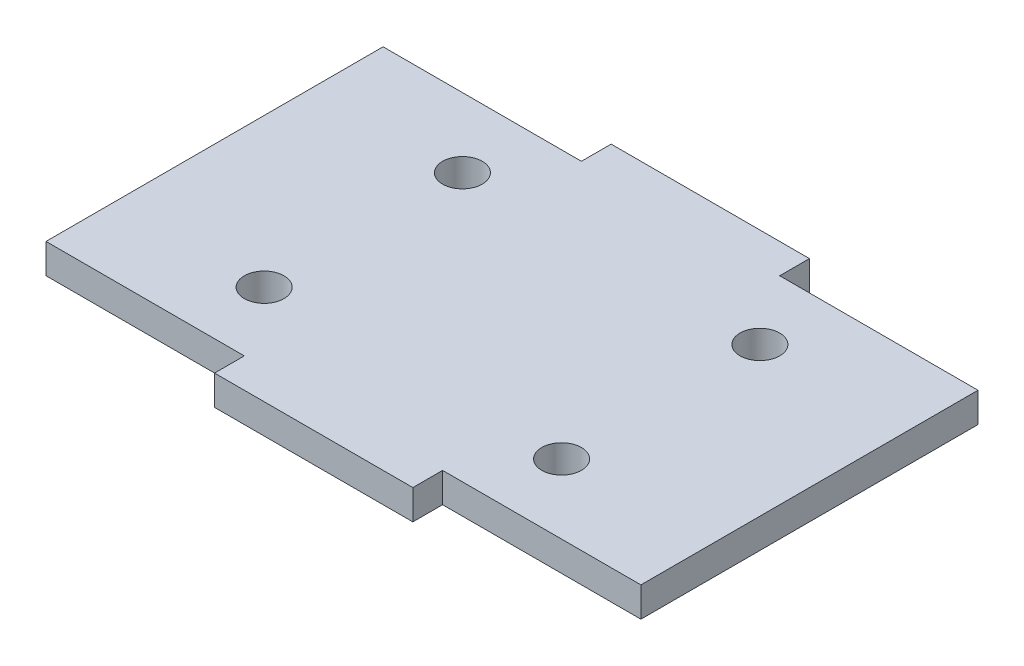
ISO-10303-21;
HEADER;
FILE_DESCRIPTION(('STEP AP214'),'2;1');
FILE_NAME('part.step','',(''),(''),'','','');
FILE_SCHEMA(('AUTOMOTIVE_DESIGN { 1 0 10303 214 1 1 1 1 }'));
ENDSEC;
DATA;
#1=APPLICATION_CONTEXT('core data for automotive mechanical design processes');
#2=APPLICATION_PROTOCOL_DEFINITION('international standard','automotive_design',2000,#1);
#3=PRODUCT_CONTEXT('',#1,'mechanical');
#4=PRODUCT('Part','Part','',(#3));
#5=PRODUCT_RELATED_PRODUCT_CATEGORY('part','',(#4));
#6=PRODUCT_DEFINITION_FORMATION('','',#4);
#7=PRODUCT_DEFINITION_CONTEXT('part definition',#1,'design');
#8=PRODUCT_DEFINITION('design','',#6,#7);
#9=PRODUCT_DEFINITION_SHAPE('','',#8);
#10=(LENGTH_UNIT() NAMED_UNIT(*) SI_UNIT(.MILLI.,.METRE.));
#11=(NAMED_UNIT(*) PLANE_ANGLE_UNIT() SI_UNIT($,.RADIAN.));
#12=(NAMED_UNIT(*) SI_UNIT($,.STERADIAN.) SOLID_ANGLE_UNIT());
#13=UNCERTAINTY_MEASURE_WITH_UNIT(LENGTH_MEASURE(1.E-05),#10,'distance_accuracy_value','');
#14=(GEOMETRIC_REPRESENTATION_CONTEXT(3) GLOBAL_UNCERTAINTY_ASSIGNED_CONTEXT((#13)) GLOBAL_UNIT_ASSIGNED_CONTEXT((#10,
#11,#12)) REPRESENTATION_CONTEXT('',''));
#15=CARTESIAN_POINT('',(0.,0.,0.));
#16=DIRECTION('',(0.,0.,1.));
#17=DIRECTION('',(1.,0.,0.));
#18=AXIS2_PLACEMENT_3D('',#15,#16,#17);
#19=CARTESIAN_POINT('',(-30.,3.,20.));
#20=DIRECTION('',(1.,0.,0.));
#21=DIRECTION('',(0.,0.,-1.));
#22=AXIS2_PLACEMENT_3D('',#19,#20,#21);
#23=PLANE('',#22);
#24=DIRECTION('',(0.,0.,1.));
#25=VECTOR('',#24,1.);
#26=CARTESIAN_POINT('',(-30.,3.,20.));
#27=LINE('',#26,#25);
#28=CARTESIAN_POINT('',(-30.,3.,-17.));
#29=VERTEX_POINT('',#28);
#30=CARTESIAN_POINT('',(-30.,3.,17.));
#31=VERTEX_POINT('',#30);
#32=EDGE_CURVE('E138',#29,#31,#27,.T.);
#33=ORIENTED_EDGE('',*,*,#32,.F.);
#34=DIRECTION('',(0.,1.,0.));
#35=VECTOR('',#34,1.);
#36=CARTESIAN_POINT('',(-30.,0.,-17.));
#37=LINE('',#36,#35);
#38=CARTESIAN_POINT('',(-30.,0.,-17.));
#39=VERTEX_POINT('',#38);
#40=EDGE_CURVE('E126',#39,#29,#37,.T.);
#41=ORIENTED_EDGE('',*,*,#40,.F.);
#42=DIRECTION('',(0.,0.,1.));
#43=VECTOR('',#42,1.);
#44=CARTESIAN_POINT('',(-30.,0.,20.));
#45=LINE('',#44,#43);
#46=CARTESIAN_POINT('',(-30.,0.,17.));
#47=VERTEX_POINT('',#46);
#48=EDGE_CURVE('E136',#39,#47,#45,.T.);
#49=ORIENTED_EDGE('',*,*,#48,.T.);
#50=DIRECTION('',(0.,1.,0.));
#51=VECTOR('',#50,1.);
#52=CARTESIAN_POINT('',(-30.,0.,17.));
#53=LINE('',#52,#51);
#54=EDGE_CURVE('E151',#47,#31,#53,.T.);
#55=ORIENTED_EDGE('',*,*,#54,.T.);
#56=EDGE_LOOP('',(#33,#41,#49,#55));
#57=FACE_BOUND('',#56,.T.);
#58=ADVANCED_FACE('F34',(#57),#23,.F.);
#59=CARTESIAN_POINT('',(30.,3.,20.));
#60=DIRECTION('',(0.,0.,-1.));
#61=DIRECTION('',(-1.,0.,0.));
#62=AXIS2_PLACEMENT_3D('',#59,#60,#61);
#63=PLANE('',#62);
#64=DIRECTION('',(1.,0.,0.));
#65=VECTOR('',#64,1.);
#66=CARTESIAN_POINT('',(30.,0.,20.));
#67=LINE('',#66,#65);
#68=CARTESIAN_POINT('',(-10.,0.,20.));
#69=VERTEX_POINT('',#68);
#70=CARTESIAN_POINT('',(9.99999999999999,0.,20.));
#71=VERTEX_POINT('',#70);
#72=EDGE_CURVE('E144',#69,#71,#67,.T.);
#73=ORIENTED_EDGE('',*,*,#72,.T.);
#74=DIRECTION('',(0.,1.,0.));
#75=VECTOR('',#74,1.);
#76=CARTESIAN_POINT('',(9.99999999999999,3.,20.));
#77=LINE('',#76,#75);
#78=CARTESIAN_POINT('',(9.99999999999999,3.,20.));
#79=VERTEX_POINT('',#78);
#80=EDGE_CURVE('E186',#71,#79,#77,.T.);
#81=ORIENTED_EDGE('',*,*,#80,.T.);
#82=DIRECTION('',(1.,0.,0.));
#83=VECTOR('',#82,1.);
#84=CARTESIAN_POINT('',(30.,3.,20.));
#85=LINE('',#84,#83);
#86=CARTESIAN_POINT('',(-10.,3.,20.));
#87=VERTEX_POINT('',#86);
#88=EDGE_CURVE('E169',#87,#79,#85,.T.);
#89=ORIENTED_EDGE('',*,*,#88,.F.);
#90=DIRECTION('',(0.,-1.,0.));
#91=VECTOR('',#90,1.);
#92=CARTESIAN_POINT('',(-10.,3.,20.));
#93=LINE('',#92,#91);
#94=EDGE_CURVE('E145',#87,#69,#93,.T.);
#95=ORIENTED_EDGE('',*,*,#94,.T.);
#96=EDGE_LOOP('',(#73,#81,#89,#95));
#97=FACE_BOUND('',#96,.T.);
#98=ADVANCED_FACE('F288',(#97),#63,.F.);
#99=CARTESIAN_POINT('',(30.,3.,20.));
#100=DIRECTION('',(-1.,0.,0.));
#101=DIRECTION('',(0.,0.,1.));
#102=AXIS2_PLACEMENT_3D('',#99,#100,#101);
#103=PLANE('',#102);
#104=DIRECTION('',(0.,0.,-1.));
#105=VECTOR('',#104,1.);
#106=CARTESIAN_POINT('',(30.,0.,20.));
#107=LINE('',#106,#105);
#108=CARTESIAN_POINT('',(30.,0.,17.));
#109=VERTEX_POINT('',#108);
#110=CARTESIAN_POINT('',(30.,0.,-17.));
#111=VERTEX_POINT('',#110);
#112=EDGE_CURVE('E148',#109,#111,#107,.T.);
#113=ORIENTED_EDGE('',*,*,#112,.T.);
#114=DIRECTION('',(0.,1.,0.));
#115=VECTOR('',#114,1.);
#116=CARTESIAN_POINT('',(30.,0.,-17.));
#117=LINE('',#116,#115);
#118=CARTESIAN_POINT('',(30.,3.,-17.));
#119=VERTEX_POINT('',#118);
#120=EDGE_CURVE('E208',#111,#119,#117,.T.);
#121=ORIENTED_EDGE('',*,*,#120,.T.);
#122=DIRECTION('',(0.,0.,-1.));
#123=VECTOR('',#122,1.);
#124=CARTESIAN_POINT('',(30.,3.,20.));
#125=LINE('',#124,#123);
#126=CARTESIAN_POINT('',(30.,3.,17.));
#127=VERTEX_POINT('',#126);
#128=EDGE_CURVE('E163',#127,#119,#125,.T.);
#129=ORIENTED_EDGE('',*,*,#128,.F.);
#130=DIRECTION('',(0.,1.,0.));
#131=VECTOR('',#130,1.);
#132=CARTESIAN_POINT('',(30.,0.,17.));
#133=LINE('',#132,#131);
#134=EDGE_CURVE('E191',#109,#127,#133,.T.);
#135=ORIENTED_EDGE('',*,*,#134,.F.);
#136=EDGE_LOOP('',(#113,#121,#129,#135));
#137=FACE_BOUND('',#136,.T.);
#138=ADVANCED_FACE('F278',(#137),#103,.F.);
#139=CARTESIAN_POINT('',(30.,3.,-20.));
#140=DIRECTION('',(0.,0.,1.));
#141=DIRECTION('',(1.,0.,0.));
#142=AXIS2_PLACEMENT_3D('',#139,#140,#141);
#143=PLANE('',#142);
#144=DIRECTION('',(-1.,0.,0.));
#145=VECTOR('',#144,1.);
#146=CARTESIAN_POINT('',(30.,0.,-20.));
#147=LINE('',#146,#145);
#148=CARTESIAN_POINT('',(9.99999999999999,0.,-20.));
#149=VERTEX_POINT('',#148);
#150=CARTESIAN_POINT('',(-10.,0.,-20.));
#151=VERTEX_POINT('',#150);
#152=EDGE_CURVE('E159',#149,#151,#147,.T.);
#153=ORIENTED_EDGE('',*,*,#152,.T.);
#154=DIRECTION('',(0.,1.,0.));
#155=VECTOR('',#154,1.);
#156=CARTESIAN_POINT('',(-10.,3.,-20.));
#157=LINE('',#156,#155);
#158=CARTESIAN_POINT('',(-10.,3.,-20.));
#159=VERTEX_POINT('',#158);
#160=EDGE_CURVE('E217',#151,#159,#157,.T.);
#161=ORIENTED_EDGE('',*,*,#160,.T.);
#162=DIRECTION('',(-1.,0.,0.));
#163=VECTOR('',#162,1.);
#164=CARTESIAN_POINT('',(30.,3.,-20.));
#165=LINE('',#164,#163);
#166=CARTESIAN_POINT('',(9.99999999999999,3.,-20.));
#167=VERTEX_POINT('',#166);
#168=EDGE_CURVE('E154',#167,#159,#165,.T.);
#169=ORIENTED_EDGE('',*,*,#168,.F.);
#170=DIRECTION('',(0.,-1.,0.));
#171=VECTOR('',#170,1.);
#172=CARTESIAN_POINT('',(9.99999999999999,3.,-20.));
#173=LINE('',#172,#171);
#174=EDGE_CURVE('E201',#167,#149,#173,.T.);
#175=ORIENTED_EDGE('',*,*,#174,.T.);
#176=EDGE_LOOP('',(#153,#161,#169,#175));
#177=FACE_BOUND('',#176,.T.);
#178=ADVANCED_FACE('F263',(#177),#143,.F.);
#179=CARTESIAN_POINT('',(0.,3.,0.));
#180=DIRECTION('',(0.,1.,0.));
#181=DIRECTION('',(0.,0.,1.));
#182=AXIS2_PLACEMENT_3D('',#179,#180,#181);
#183=PLANE('',#182);
#184=CARTESIAN_POINT('',(15.,3.,-10.));
#185=DIRECTION('',(0.,1.,0.));
#186=DIRECTION('',(0.,0.,-1.));
#187=AXIS2_PLACEMENT_3D('',#184,#185,#186);
#188=CIRCLE('',#187,2.);
#189=CARTESIAN_POINT('',(15.,3.,-12.));
#190=VERTEX_POINT('',#189);
#191=EDGE_CURVE('E245',#190,#190,#188,.T.);
#192=ORIENTED_EDGE('',*,*,#191,.F.);
#193=EDGE_LOOP('',(#192));
#194=FACE_BOUND('',#193,.T.);
#195=CARTESIAN_POINT('',(15.,3.,9.99999999999999));
#196=DIRECTION('',(0.,1.,0.));
#197=DIRECTION('',(0.,0.,1.));
#198=AXIS2_PLACEMENT_3D('',#195,#196,#197);
#199=CIRCLE('',#198,1.99999999999999);
#200=CARTESIAN_POINT('',(15.,3.,12.));
#201=VERTEX_POINT('',#200);
#202=EDGE_CURVE('E239',#201,#201,#199,.T.);
#203=ORIENTED_EDGE('',*,*,#202,.F.);
#204=EDGE_LOOP('',(#203));
#205=FACE_BOUND('',#204,.T.);
#206=CARTESIAN_POINT('',(-15.,3.,9.99999999999999));
#207=DIRECTION('',(0.,1.,0.));
#208=DIRECTION('',(0.,0.,-1.));
#209=AXIS2_PLACEMENT_3D('',#206,#207,#208);
#210=CIRCLE('',#209,2.);
#211=CARTESIAN_POINT('',(-15.,3.,7.99999999999999));
#212=VERTEX_POINT('',#211);
#213=EDGE_CURVE('E233',#212,#212,#210,.T.);
#214=ORIENTED_EDGE('',*,*,#213,.F.);
#215=EDGE_LOOP('',(#214));
#216=FACE_BOUND('',#215,.T.);
#217=CARTESIAN_POINT('',(-15.,3.,-10.));
#218=DIRECTION('',(0.,1.,0.));
#219=DIRECTION('',(0.,0.,1.));
#220=AXIS2_PLACEMENT_3D('',#217,#218,#219);
#221=CIRCLE('',#220,2.);
#222=CARTESIAN_POINT('',(-15.,3.,-8.));
#223=VERTEX_POINT('',#222);
#224=EDGE_CURVE('E227',#223,#223,#221,.T.);
#225=ORIENTED_EDGE('',*,*,#224,.F.);
#226=EDGE_LOOP('',(#225));
#227=FACE_BOUND('',#226,.T.);
#228=DIRECTION('',(0.,0.,-1.));
#229=VECTOR('',#228,1.);
#230=CARTESIAN_POINT('',(-10.,3.,-23.));
#231=LINE('',#230,#229);
#232=CARTESIAN_POINT('',(-10.,3.,-17.));
#233=VERTEX_POINT('',#232);
#234=EDGE_CURVE('E131',#233,#159,#231,.T.);
#235=ORIENTED_EDGE('',*,*,#234,.F.);
#236=DIRECTION('',(1.,0.,0.));
#237=VECTOR('',#236,1.);
#238=CARTESIAN_POINT('',(-10.,3.,-17.));
#239=LINE('',#238,#237);
#240=EDGE_CURVE('E223',#29,#233,#239,.T.);
#241=ORIENTED_EDGE('',*,*,#240,.F.);
#242=ORIENTED_EDGE('',*,*,#32,.T.);
#243=DIRECTION('',(-1.,0.,0.));
#244=VECTOR('',#243,1.);
#245=CARTESIAN_POINT('',(-10.,3.,17.));
#246=LINE('',#245,#244);
#247=CARTESIAN_POINT('',(-10.,3.,17.));
#248=VERTEX_POINT('',#247);
#249=EDGE_CURVE('E181',#248,#31,#246,.T.);
#250=ORIENTED_EDGE('',*,*,#249,.F.);
#251=DIRECTION('',(0.,0.,-1.));
#252=VECTOR('',#251,1.);
#253=CARTESIAN_POINT('',(-10.,3.,23.));
#254=LINE('',#253,#252);
#255=EDGE_CURVE('E184',#87,#248,#254,.T.);
#256=ORIENTED_EDGE('',*,*,#255,.F.);
#257=ORIENTED_EDGE('',*,*,#88,.T.);
#258=DIRECTION('',(0.,0.,1.));
#259=VECTOR('',#258,1.);
#260=CARTESIAN_POINT('',(9.99999999999999,3.,23.));
#261=LINE('',#260,#259);
#262=CARTESIAN_POINT('',(9.99999999999999,3.,17.));
#263=VERTEX_POINT('',#262);
#264=EDGE_CURVE('E199',#263,#79,#261,.T.);
#265=ORIENTED_EDGE('',*,*,#264,.F.);
#266=DIRECTION('',(-1.,0.,0.));
#267=VECTOR('',#266,1.);
#268=CARTESIAN_POINT('',(9.99999999999999,3.,17.));
#269=LINE('',#268,#267);
#270=EDGE_CURVE('E195',#127,#263,#269,.T.);
#271=ORIENTED_EDGE('',*,*,#270,.F.);
#272=ORIENTED_EDGE('',*,*,#128,.T.);
#273=DIRECTION('',(1.,0.,0.));
#274=VECTOR('',#273,1.);
#275=CARTESIAN_POINT('',(9.99999999999999,3.,-17.));
#276=LINE('',#275,#274);
#277=CARTESIAN_POINT('',(9.99999999999999,3.,-17.));
#278=VERTEX_POINT('',#277);
#279=EDGE_CURVE('E213',#278,#119,#276,.T.);
#280=ORIENTED_EDGE('',*,*,#279,.F.);
#281=DIRECTION('',(0.,0.,1.));
#282=VECTOR('',#281,1.);
#283=CARTESIAN_POINT('',(9.99999999999999,3.,-23.));
#284=LINE('',#283,#282);
#285=EDGE_CURVE('E215',#167,#278,#284,.T.);
#286=ORIENTED_EDGE('',*,*,#285,.F.);
#287=ORIENTED_EDGE('',*,*,#168,.T.);
#288=EDGE_LOOP('',(#235,#241,#242,#250,#256,#257,#265,#271,#272,#280,#286,#287));
#289=FACE_BOUND('',#288,.T.);
#290=ADVANCED_FACE('F260',(#194,#205,#216,#227,#289),#183,.T.);
#291=CARTESIAN_POINT('',(0.,0.,0.));
#292=DIRECTION('',(0.,1.,0.));
#293=DIRECTION('',(0.,0.,1.));
#294=AXIS2_PLACEMENT_3D('',#291,#292,#293);
#295=PLANE('',#294);
#296=CARTESIAN_POINT('',(15.,0.,-10.));
#297=DIRECTION('',(0.,1.,0.));
#298=DIRECTION('',(0.,0.,-1.));
#299=AXIS2_PLACEMENT_3D('',#296,#297,#298);
#300=CIRCLE('',#299,2.);
#301=CARTESIAN_POINT('',(15.,0.,-12.));
#302=VERTEX_POINT('',#301);
#303=EDGE_CURVE('E242',#302,#302,#300,.T.);
#304=ORIENTED_EDGE('',*,*,#303,.T.);
#305=EDGE_LOOP('',(#304));
#306=FACE_BOUND('',#305,.T.);
#307=CARTESIAN_POINT('',(15.,0.,9.99999999999999));
#308=DIRECTION('',(0.,1.,0.));
#309=DIRECTION('',(0.,0.,1.));
#310=AXIS2_PLACEMENT_3D('',#307,#308,#309);
#311=CIRCLE('',#310,1.99999999999999);
#312=CARTESIAN_POINT('',(15.,0.,12.));
#313=VERTEX_POINT('',#312);
#314=EDGE_CURVE('E236',#313,#313,#311,.T.);
#315=ORIENTED_EDGE('',*,*,#314,.T.);
#316=EDGE_LOOP('',(#315));
#317=FACE_BOUND('',#316,.T.);
#318=CARTESIAN_POINT('',(-15.,0.,9.99999999999999));
#319=DIRECTION('',(0.,1.,0.));
#320=DIRECTION('',(0.,0.,-1.));
#321=AXIS2_PLACEMENT_3D('',#318,#319,#320);
#322=CIRCLE('',#321,2.);
#323=CARTESIAN_POINT('',(-15.,0.,7.99999999999999));
#324=VERTEX_POINT('',#323);
#325=EDGE_CURVE('E230',#324,#324,#322,.T.);
#326=ORIENTED_EDGE('',*,*,#325,.T.);
#327=EDGE_LOOP('',(#326));
#328=FACE_BOUND('',#327,.T.);
#329=CARTESIAN_POINT('',(-15.,0.,-10.));
#330=DIRECTION('',(0.,1.,0.));
#331=DIRECTION('',(0.,0.,1.));
#332=AXIS2_PLACEMENT_3D('',#329,#330,#331);
#333=CIRCLE('',#332,2.);
#334=CARTESIAN_POINT('',(-15.,0.,-8.));
#335=VERTEX_POINT('',#334);
#336=EDGE_CURVE('E225',#335,#335,#333,.T.);
#337=ORIENTED_EDGE('',*,*,#336,.T.);
#338=EDGE_LOOP('',(#337));
#339=FACE_BOUND('',#338,.T.);
#340=DIRECTION('',(1.,0.,0.));
#341=VECTOR('',#340,1.);
#342=CARTESIAN_POINT('',(-10.,0.,-17.));
#343=LINE('',#342,#341);
#344=CARTESIAN_POINT('',(-10.,0.,-17.));
#345=VERTEX_POINT('',#344);
#346=EDGE_CURVE('E122',#39,#345,#343,.T.);
#347=ORIENTED_EDGE('',*,*,#346,.T.);
#348=DIRECTION('',(0.,0.,-1.));
#349=VECTOR('',#348,1.);
#350=CARTESIAN_POINT('',(-10.,0.,-23.));
#351=LINE('',#350,#349);
#352=EDGE_CURVE('E48',#345,#151,#351,.T.);
#353=ORIENTED_EDGE('',*,*,#352,.T.);
#354=ORIENTED_EDGE('',*,*,#152,.F.);
#355=DIRECTION('',(0.,0.,1.));
#356=VECTOR('',#355,1.);
#357=CARTESIAN_POINT('',(9.99999999999999,0.,0.));
#358=LINE('',#357,#356);
#359=CARTESIAN_POINT('',(9.99999999999999,0.,-17.));
#360=VERTEX_POINT('',#359);
#361=EDGE_CURVE('E11',#149,#360,#358,.T.);
#362=ORIENTED_EDGE('',*,*,#361,.T.);
#363=DIRECTION('',(1.,0.,0.));
#364=VECTOR('',#363,1.);
#365=CARTESIAN_POINT('',(9.99999999999999,0.,-17.));
#366=LINE('',#365,#364);
#367=EDGE_CURVE('E56',#360,#111,#366,.T.);
#368=ORIENTED_EDGE('',*,*,#367,.T.);
#369=ORIENTED_EDGE('',*,*,#112,.F.);
#370=DIRECTION('',(-1.,0.,0.));
#371=VECTOR('',#370,1.);
#372=CARTESIAN_POINT('',(9.99999999999999,0.,17.));
#373=LINE('',#372,#371);
#374=CARTESIAN_POINT('',(9.99999999999999,0.,17.));
#375=VERTEX_POINT('',#374);
#376=EDGE_CURVE('E193',#109,#375,#373,.T.);
#377=ORIENTED_EDGE('',*,*,#376,.T.);
#378=DIRECTION('',(0.,0.,1.));
#379=VECTOR('',#378,1.);
#380=CARTESIAN_POINT('',(9.99999999999999,0.,23.));
#381=LINE('',#380,#379);
#382=EDGE_CURVE('E198',#375,#71,#381,.T.);
#383=ORIENTED_EDGE('',*,*,#382,.T.);
#384=ORIENTED_EDGE('',*,*,#72,.F.);
#385=DIRECTION('',(0.,0.,-1.));
#386=VECTOR('',#385,1.);
#387=CARTESIAN_POINT('',(-10.,0.,0.));
#388=LINE('',#387,#386);
#389=CARTESIAN_POINT('',(-10.,0.,17.));
#390=VERTEX_POINT('',#389);
#391=EDGE_CURVE('E41',#69,#390,#388,.T.);
#392=ORIENTED_EDGE('',*,*,#391,.T.);
#393=DIRECTION('',(-1.,0.,0.));
#394=VECTOR('',#393,1.);
#395=CARTESIAN_POINT('',(-10.,0.,17.));
#396=LINE('',#395,#394);
#397=EDGE_CURVE('E143',#390,#47,#396,.T.);
#398=ORIENTED_EDGE('',*,*,#397,.T.);
#399=ORIENTED_EDGE('',*,*,#48,.F.);
#400=EDGE_LOOP('',(#347,#353,#354,#362,#368,#369,#377,#383,#384,#392,#398,#399));
#401=FACE_BOUND('',#400,.T.);
#402=ADVANCED_FACE('F141',(#306,#317,#328,#339,#401),#295,.F.);
#403=CARTESIAN_POINT('',(-10.,0.,23.));
#404=DIRECTION('',(1.,0.,0.));
#405=DIRECTION('',(0.,0.,-1.));
#406=AXIS2_PLACEMENT_3D('',#403,#404,#405);
#407=PLANE('',#406);
#408=ORIENTED_EDGE('',*,*,#255,.T.);
#409=DIRECTION('',(0.,1.,0.));
#410=VECTOR('',#409,1.);
#411=CARTESIAN_POINT('',(-10.,0.,17.));
#412=LINE('',#411,#410);
#413=EDGE_CURVE('E177',#390,#248,#412,.T.);
#414=ORIENTED_EDGE('',*,*,#413,.F.);
#415=ORIENTED_EDGE('',*,*,#391,.F.);
#416=ORIENTED_EDGE('',*,*,#94,.F.);
#417=EDGE_LOOP('',(#408,#414,#415,#416));
#418=FACE_BOUND('',#417,.T.);
#419=ADVANCED_FACE('F293',(#418),#407,.F.);
#420=CARTESIAN_POINT('',(-10.,0.,17.));
#421=DIRECTION('',(0.,0.,-1.));
#422=DIRECTION('',(-1.,0.,0.));
#423=AXIS2_PLACEMENT_3D('',#420,#421,#422);
#424=PLANE('',#423);
#425=ORIENTED_EDGE('',*,*,#249,.T.);
#426=ORIENTED_EDGE('',*,*,#54,.F.);
#427=ORIENTED_EDGE('',*,*,#397,.F.);
#428=ORIENTED_EDGE('',*,*,#413,.T.);
#429=EDGE_LOOP('',(#425,#426,#427,#428));
#430=FACE_BOUND('',#429,.T.);
#431=ADVANCED_FACE('F295',(#430),#424,.F.);
#432=CARTESIAN_POINT('',(9.99999999999999,0.,23.));
#433=DIRECTION('',(-1.,0.,0.));
#434=DIRECTION('',(0.,0.,1.));
#435=AXIS2_PLACEMENT_3D('',#432,#433,#434);
#436=PLANE('',#435);
#437=ORIENTED_EDGE('',*,*,#382,.F.);
#438=DIRECTION('',(0.,1.,0.));
#439=VECTOR('',#438,1.);
#440=CARTESIAN_POINT('',(9.99999999999999,0.,17.));
#441=LINE('',#440,#439);
#442=EDGE_CURVE('E190',#375,#263,#441,.T.);
#443=ORIENTED_EDGE('',*,*,#442,.T.);
#444=ORIENTED_EDGE('',*,*,#264,.T.);
#445=ORIENTED_EDGE('',*,*,#80,.F.);
#446=EDGE_LOOP('',(#437,#443,#444,#445));
#447=FACE_BOUND('',#446,.T.);
#448=ADVANCED_FACE('F285',(#447),#436,.F.);
#449=CARTESIAN_POINT('',(9.99999999999999,0.,17.));
#450=DIRECTION('',(0.,0.,-1.));
#451=DIRECTION('',(-1.,0.,0.));
#452=AXIS2_PLACEMENT_3D('',#449,#450,#451);
#453=PLANE('',#452);
#454=ORIENTED_EDGE('',*,*,#270,.T.);
#455=ORIENTED_EDGE('',*,*,#442,.F.);
#456=ORIENTED_EDGE('',*,*,#376,.F.);
#457=ORIENTED_EDGE('',*,*,#134,.T.);
#458=EDGE_LOOP('',(#454,#455,#456,#457));
#459=FACE_BOUND('',#458,.T.);
#460=ADVANCED_FACE('F282',(#459),#453,.F.);
#461=CARTESIAN_POINT('',(9.99999999999999,0.,-23.));
#462=DIRECTION('',(-1.,0.,0.));
#463=DIRECTION('',(0.,0.,1.));
#464=AXIS2_PLACEMENT_3D('',#461,#462,#463);
#465=PLANE('',#464);
#466=ORIENTED_EDGE('',*,*,#285,.T.);
#467=DIRECTION('',(0.,1.,0.));
#468=VECTOR('',#467,1.);
#469=CARTESIAN_POINT('',(9.99999999999999,0.,-17.));
#470=LINE('',#469,#468);
#471=EDGE_CURVE('E209',#360,#278,#470,.T.);
#472=ORIENTED_EDGE('',*,*,#471,.F.);
#473=ORIENTED_EDGE('',*,*,#361,.F.);
#474=ORIENTED_EDGE('',*,*,#174,.F.);
#475=EDGE_LOOP('',(#466,#472,#473,#474));
#476=FACE_BOUND('',#475,.T.);
#477=ADVANCED_FACE('F275',(#476),#465,.F.);
#478=CARTESIAN_POINT('',(9.99999999999999,0.,-17.));
#479=DIRECTION('',(0.,0.,1.));
#480=DIRECTION('',(1.,0.,0.));
#481=AXIS2_PLACEMENT_3D('',#478,#479,#480);
#482=PLANE('',#481);
#483=ORIENTED_EDGE('',*,*,#279,.T.);
#484=ORIENTED_EDGE('',*,*,#120,.F.);
#485=ORIENTED_EDGE('',*,*,#367,.F.);
#486=ORIENTED_EDGE('',*,*,#471,.T.);
#487=EDGE_LOOP('',(#483,#484,#485,#486));
#488=FACE_BOUND('',#487,.T.);
#489=ADVANCED_FACE('F276',(#488),#482,.F.);
#490=CARTESIAN_POINT('',(-10.,0.,-23.));
#491=DIRECTION('',(1.,0.,0.));
#492=DIRECTION('',(0.,0.,-1.));
#493=AXIS2_PLACEMENT_3D('',#490,#491,#492);
#494=PLANE('',#493);
#495=ORIENTED_EDGE('',*,*,#352,.F.);
#496=DIRECTION('',(0.,1.,0.));
#497=VECTOR('',#496,1.);
#498=CARTESIAN_POINT('',(-10.,0.,-17.));
#499=LINE('',#498,#497);
#500=EDGE_CURVE('E128',#345,#233,#499,.T.);
#501=ORIENTED_EDGE('',*,*,#500,.T.);
#502=ORIENTED_EDGE('',*,*,#234,.T.);
#503=ORIENTED_EDGE('',*,*,#160,.F.);
#504=EDGE_LOOP('',(#495,#501,#502,#503));
#505=FACE_BOUND('',#504,.T.);
#506=ADVANCED_FACE('F270',(#505),#494,.F.);
#507=CARTESIAN_POINT('',(-10.,0.,-17.));
#508=DIRECTION('',(0.,0.,1.));
#509=DIRECTION('',(1.,0.,0.));
#510=AXIS2_PLACEMENT_3D('',#507,#508,#509);
#511=PLANE('',#510);
#512=ORIENTED_EDGE('',*,*,#240,.T.);
#513=ORIENTED_EDGE('',*,*,#500,.F.);
#514=ORIENTED_EDGE('',*,*,#346,.F.);
#515=ORIENTED_EDGE('',*,*,#40,.T.);
#516=EDGE_LOOP('',(#512,#513,#514,#515));
#517=FACE_BOUND('',#516,.T.);
#518=ADVANCED_FACE('F125',(#517),#511,.F.);
#519=CARTESIAN_POINT('',(-15.,0.,-10.));
#520=DIRECTION('',(0.,1.,0.));
#521=DIRECTION('',(0.,0.,1.));
#522=AXIS2_PLACEMENT_3D('',#519,#520,#521);
#523=CYLINDRICAL_SURFACE('',#522,2.);
#524=ORIENTED_EDGE('',*,*,#336,.F.);
#525=EDGE_LOOP('',(#524));
#526=FACE_BOUND('',#525,.T.);
#527=ORIENTED_EDGE('',*,*,#224,.T.);
#528=EDGE_LOOP('',(#527));
#529=FACE_BOUND('',#528,.T.);
#530=ADVANCED_FACE('F379',(#526,#529),#523,.F.);
#531=CARTESIAN_POINT('',(-15.,0.,9.99999999999999));
#532=DIRECTION('',(0.,1.,0.));
#533=DIRECTION('',(0.,0.,1.));
#534=AXIS2_PLACEMENT_3D('',#531,#532,#533);
#535=CYLINDRICAL_SURFACE('',#534,2.);
#536=ORIENTED_EDGE('',*,*,#325,.F.);
#537=EDGE_LOOP('',(#536));
#538=FACE_BOUND('',#537,.T.);
#539=ORIENTED_EDGE('',*,*,#213,.T.);
#540=EDGE_LOOP('',(#539));
#541=FACE_BOUND('',#540,.T.);
#542=ADVANCED_FACE('F410',(#538,#541),#535,.F.);
#543=CARTESIAN_POINT('',(15.,0.,9.99999999999999));
#544=DIRECTION('',(0.,1.,0.));
#545=DIRECTION('',(0.,0.,1.));
#546=AXIS2_PLACEMENT_3D('',#543,#544,#545);
#547=CYLINDRICAL_SURFACE('',#546,1.99999999999999);
#548=ORIENTED_EDGE('',*,*,#314,.F.);
#549=EDGE_LOOP('',(#548));
#550=FACE_BOUND('',#549,.T.);
#551=ORIENTED_EDGE('',*,*,#202,.T.);
#552=EDGE_LOOP('',(#551));
#553=FACE_BOUND('',#552,.T.);
#554=ADVANCED_FACE('F256',(#550,#553),#547,.F.);
#555=CARTESIAN_POINT('',(15.,0.,-10.));
#556=DIRECTION('',(0.,1.,0.));
#557=DIRECTION('',(0.,0.,1.));
#558=AXIS2_PLACEMENT_3D('',#555,#556,#557);
#559=CYLINDRICAL_SURFACE('',#558,2.);
#560=ORIENTED_EDGE('',*,*,#303,.F.);
#561=EDGE_LOOP('',(#560));
#562=FACE_BOUND('',#561,.T.);
#563=ORIENTED_EDGE('',*,*,#191,.T.);
#564=EDGE_LOOP('',(#563));
#565=FACE_BOUND('',#564,.T.);
#566=ADVANCED_FACE('F253',(#562,#565),#559,.F.);
#567=CLOSED_SHELL('',(#58,#98,#138,#178,#290,#402,#419,#431,#448,#460,#477,#489,#506,#518,#530,
#542,#554,#566));
#568=MANIFOLD_SOLID_BREP('B2',#567);
#569=ADVANCED_BREP_SHAPE_REPRESENTATION('',(#18,#568),#14);
#570=SHAPE_DEFINITION_REPRESENTATION(#9,#569);
ENDSEC;
END-ISO-10303-21;
